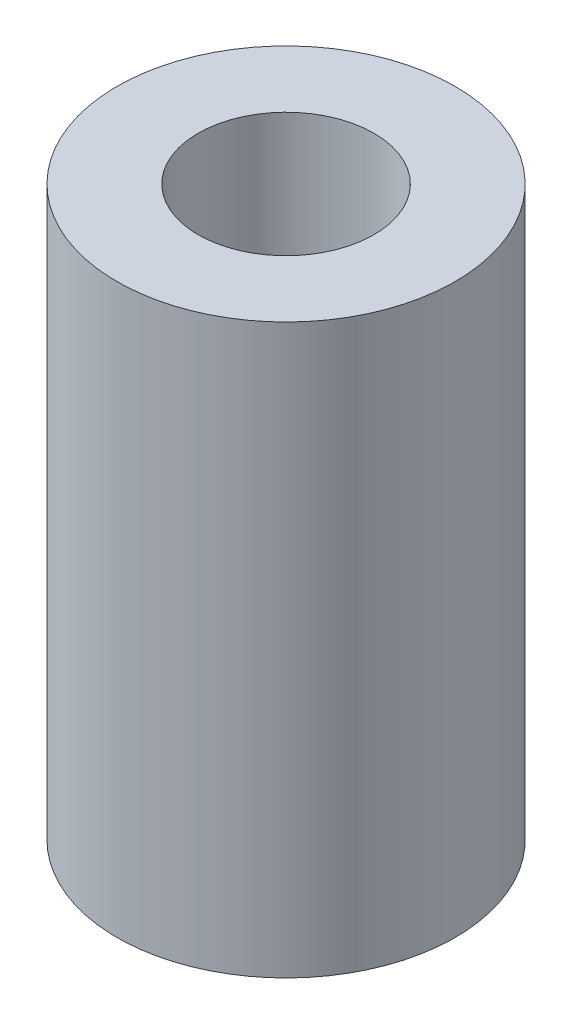
ISO-10303-21;
HEADER;
FILE_DESCRIPTION(('STEP AP214'),'2;1');
FILE_NAME('part.step','',(''),(''),'','','');
FILE_SCHEMA(('AUTOMOTIVE_DESIGN { 1 0 10303 214 1 1 1 1 }'));
ENDSEC;
DATA;
#1=APPLICATION_CONTEXT('core data for automotive mechanical design processes');
#2=APPLICATION_PROTOCOL_DEFINITION('international standard','automotive_design',2000,#1);
#3=PRODUCT_CONTEXT('',#1,'mechanical');
#4=PRODUCT('Part','Part','',(#3));
#5=PRODUCT_RELATED_PRODUCT_CATEGORY('part','',(#4));
#6=PRODUCT_DEFINITION_FORMATION('','',#4);
#7=PRODUCT_DEFINITION_CONTEXT('part definition',#1,'design');
#8=PRODUCT_DEFINITION('design','',#6,#7);
#9=PRODUCT_DEFINITION_SHAPE('','',#8);
#10=(LENGTH_UNIT() NAMED_UNIT(*) SI_UNIT(.MILLI.,.METRE.));
#11=(NAMED_UNIT(*) PLANE_ANGLE_UNIT() SI_UNIT($,.RADIAN.));
#12=(NAMED_UNIT(*) SI_UNIT($,.STERADIAN.) SOLID_ANGLE_UNIT());
#13=UNCERTAINTY_MEASURE_WITH_UNIT(LENGTH_MEASURE(1.E-05),#10,'distance_accuracy_value','');
#14=(GEOMETRIC_REPRESENTATION_CONTEXT(3) GLOBAL_UNCERTAINTY_ASSIGNED_CONTEXT((#13)) GLOBAL_UNIT_ASSIGNED_CONTEXT((#10,
#11,#12)) REPRESENTATION_CONTEXT('',''));
#15=CARTESIAN_POINT('',(0.,0.,0.));
#16=DIRECTION('',(0.,0.,1.));
#17=DIRECTION('',(1.,0.,0.));
#18=AXIS2_PLACEMENT_3D('',#15,#16,#17);
#19=CARTESIAN_POINT('',(0.,21.,0.));
#20=DIRECTION('',(0.,1.,0.));
#21=DIRECTION('',(0.,0.,1.));
#22=AXIS2_PLACEMENT_3D('',#19,#20,#21);
#23=PLANE('',#22);
#24=CARTESIAN_POINT('',(0.,21.,0.));
#25=DIRECTION('',(0.,1.,0.));
#26=DIRECTION('',(0.,0.,1.));
#27=AXIS2_PLACEMENT_3D('',#24,#25,#26);
#28=CIRCLE('',#27,6.25);
#29=CARTESIAN_POINT('',(0.,21.,-6.25));
#30=VERTEX_POINT('',#29);
#31=EDGE_CURVE('E10',#30,#30,#28,.T.);
#32=ORIENTED_EDGE('',*,*,#31,.T.);
#33=EDGE_LOOP('',(#32));
#34=FACE_BOUND('',#33,.T.);
#35=CARTESIAN_POINT('',(0.,21.,0.));
#36=DIRECTION('',(0.,1.,0.));
#37=DIRECTION('',(0.,0.,1.));
#38=AXIS2_PLACEMENT_3D('',#35,#36,#37);
#39=CIRCLE('',#38,3.25);
#40=CARTESIAN_POINT('',(0.,21.,-3.25));
#41=VERTEX_POINT('',#40);
#42=EDGE_CURVE('E43',#41,#41,#39,.T.);
#43=ORIENTED_EDGE('',*,*,#42,.F.);
#44=EDGE_LOOP('',(#43));
#45=FACE_BOUND('',#44,.T.);
#46=ADVANCED_FACE('F32',(#34,#45),#23,.T.);
#47=CARTESIAN_POINT('',(0.,0.,0.));
#48=DIRECTION('',(0.,1.,0.));
#49=DIRECTION('',(0.,0.,1.));
#50=AXIS2_PLACEMENT_3D('',#47,#48,#49);
#51=PLANE('',#50);
#52=CARTESIAN_POINT('',(0.,0.,0.));
#53=DIRECTION('',(0.,1.,0.));
#54=DIRECTION('',(0.,0.,1.));
#55=AXIS2_PLACEMENT_3D('',#52,#53,#54);
#56=CIRCLE('',#55,6.25);
#57=CARTESIAN_POINT('',(0.,0.,-6.25));
#58=VERTEX_POINT('',#57);
#59=EDGE_CURVE('E36',#58,#58,#56,.T.);
#60=ORIENTED_EDGE('',*,*,#59,.F.);
#61=EDGE_LOOP('',(#60));
#62=FACE_BOUND('',#61,.T.);
#63=CARTESIAN_POINT('',(0.,0.,0.));
#64=DIRECTION('',(0.,1.,0.));
#65=DIRECTION('',(0.,0.,1.));
#66=AXIS2_PLACEMENT_3D('',#63,#64,#65);
#67=CIRCLE('',#66,3.25);
#68=CARTESIAN_POINT('',(0.,0.,-3.25));
#69=VERTEX_POINT('',#68);
#70=EDGE_CURVE('E45',#69,#69,#67,.T.);
#71=ORIENTED_EDGE('',*,*,#70,.T.);
#72=EDGE_LOOP('',(#71));
#73=FACE_BOUND('',#72,.T.);
#74=ADVANCED_FACE('F55',(#62,#73),#51,.F.);
#75=CARTESIAN_POINT('',(0.,21.,0.));
#76=DIRECTION('',(0.,-1.,0.));
#77=DIRECTION('',(0.,0.,-1.));
#78=AXIS2_PLACEMENT_3D('',#75,#76,#77);
#79=CYLINDRICAL_SURFACE('',#78,6.25);
#80=CARTESIAN_POINT('',(0.,21.,-6.25));
#81=CARTESIAN_POINT('',(0.,20.78125,-6.25));
#82=CARTESIAN_POINT('',(0.,20.5625,-6.25));
#83=CARTESIAN_POINT('',(0.,20.125,-6.25));
#84=CARTESIAN_POINT('',(0.,19.90625,-6.25));
#85=CARTESIAN_POINT('',(0.,19.46875,-6.25));
#86=CARTESIAN_POINT('',(0.,19.25,-6.25));
#87=CARTESIAN_POINT('',(0.,18.8125,-6.25));
#88=CARTESIAN_POINT('',(0.,18.59375,-6.25));
#89=CARTESIAN_POINT('',(0.,18.15625,-6.25));
#90=CARTESIAN_POINT('',(0.,17.9375,-6.25));
#91=CARTESIAN_POINT('',(0.,17.5,-6.25));
#92=CARTESIAN_POINT('',(0.,17.28125,-6.25));
#93=CARTESIAN_POINT('',(0.,16.84375,-6.25));
#94=CARTESIAN_POINT('',(0.,16.625,-6.25));
#95=CARTESIAN_POINT('',(0.,16.1875,-6.25));
#96=CARTESIAN_POINT('',(0.,15.96875,-6.25));
#97=CARTESIAN_POINT('',(0.,15.53125,-6.25));
#98=CARTESIAN_POINT('',(0.,15.3125,-6.25));
#99=CARTESIAN_POINT('',(0.,14.875,-6.25));
#100=CARTESIAN_POINT('',(0.,14.65625,-6.25));
#101=CARTESIAN_POINT('',(0.,14.21875,-6.25));
#102=CARTESIAN_POINT('',(0.,14.,-6.25));
#103=CARTESIAN_POINT('',(0.,13.5625,-6.25));
#104=CARTESIAN_POINT('',(0.,13.34375,-6.25));
#105=CARTESIAN_POINT('',(0.,12.90625,-6.25));
#106=CARTESIAN_POINT('',(0.,12.6875,-6.25));
#107=CARTESIAN_POINT('',(0.,12.25,-6.25));
#108=CARTESIAN_POINT('',(0.,12.03125,-6.25));
#109=CARTESIAN_POINT('',(0.,11.59375,-6.25));
#110=CARTESIAN_POINT('',(0.,11.375,-6.25));
#111=CARTESIAN_POINT('',(0.,10.9375,-6.25));
#112=CARTESIAN_POINT('',(0.,10.71875,-6.25));
#113=CARTESIAN_POINT('',(0.,10.28125,-6.25));
#114=CARTESIAN_POINT('',(0.,10.0625,-6.25));
#115=CARTESIAN_POINT('',(0.,9.625,-6.25));
#116=CARTESIAN_POINT('',(0.,9.40625,-6.25));
#117=CARTESIAN_POINT('',(0.,8.96875,-6.25));
#118=CARTESIAN_POINT('',(0.,8.75,-6.25));
#119=CARTESIAN_POINT('',(0.,8.3125,-6.25));
#120=CARTESIAN_POINT('',(0.,8.09375,-6.25));
#121=CARTESIAN_POINT('',(0.,7.65625,-6.25));
#122=CARTESIAN_POINT('',(0.,7.4375,-6.25));
#123=CARTESIAN_POINT('',(0.,7.,-6.25));
#124=CARTESIAN_POINT('',(0.,6.78125,-6.25));
#125=CARTESIAN_POINT('',(0.,6.34375,-6.25));
#126=CARTESIAN_POINT('',(0.,6.125,-6.25));
#127=CARTESIAN_POINT('',(0.,5.6875,-6.25));
#128=CARTESIAN_POINT('',(0.,5.46875,-6.25));
#129=CARTESIAN_POINT('',(0.,5.03125,-6.25));
#130=CARTESIAN_POINT('',(0.,4.8125,-6.25));
#131=CARTESIAN_POINT('',(0.,4.375,-6.25));
#132=CARTESIAN_POINT('',(0.,4.15625,-6.25));
#133=CARTESIAN_POINT('',(0.,3.71875,-6.25));
#134=CARTESIAN_POINT('',(0.,3.5,-6.25));
#135=CARTESIAN_POINT('',(0.,3.0625,-6.25));
#136=CARTESIAN_POINT('',(0.,2.84375,-6.25));
#137=CARTESIAN_POINT('',(0.,2.40625,-6.25));
#138=CARTESIAN_POINT('',(0.,2.1875,-6.25));
#139=CARTESIAN_POINT('',(0.,1.75,-6.25));
#140=CARTESIAN_POINT('',(0.,1.53125,-6.25));
#141=CARTESIAN_POINT('',(0.,1.09375,-6.25));
#142=CARTESIAN_POINT('',(0.,0.875000000000001,-6.25));
#143=CARTESIAN_POINT('',(0.,0.4375,-6.25));
#144=CARTESIAN_POINT('',(0.,0.21875,-6.25));
#145=CARTESIAN_POINT('',(0.,0.,-6.25));
#146=B_SPLINE_CURVE_WITH_KNOTS('',3,(#80,#81,#82,#83,#84,#85,#86,#87,#88,#89,#90,#91,#92,#93,
#94,#95,#96,#97,#98,#99,#100,#101,#102,#103,#104,#105,#106,#107,#108,#109,#110,#111,#112,#113,
#114,#115,#116,#117,#118,#119,#120,#121,#122,#123,#124,#125,#126,#127,#128,#129,#130,#131,#132,
#133,#134,#135,#136,#137,#138,#139,#140,#141,#142,#143,#144,#145),.UNSPECIFIED.,.F.,.F.,(4,2,2,
2,2,2,2,2,2,2,2,2,2,2,2,2,2,2,2,2,2,2,2,2,2,2,2,2,2,2,2,2,4),(0.,0.656250000000001,1.3125,
1.96875,2.625,3.28125,3.9375,4.59375,5.25,5.90625,6.5625,7.21875,7.875,8.53125,9.1875,9.84375,
10.5,11.15625,11.8125,12.46875,13.125,13.78125,14.4375,15.09375,15.75,16.40625,17.0625,17.71875,
18.375,19.03125,19.6875,20.34375,21.),.UNSPECIFIED.);
#147=EDGE_CURVE('BSEAM34',#30,#58,#146,.T.);
#148=ORIENTED_EDGE('',*,*,#31,.F.);
#149=ORIENTED_EDGE('',*,*,#59,.T.);
#150=ORIENTED_EDGE('',*,*,#147,.T.);
#151=ORIENTED_EDGE('',*,*,#147,.F.);
#152=EDGE_LOOP('',(#148,#150,#149,#151));
#153=FACE_BOUND('',#152,.T.);
#154=ADVANCED_FACE('F34',(#153),#79,.T.);
#155=CARTESIAN_POINT('',(0.,21.,0.));
#156=DIRECTION('',(0.,-1.,0.));
#157=DIRECTION('',(0.,0.,-1.));
#158=AXIS2_PLACEMENT_3D('',#155,#156,#157);
#159=CYLINDRICAL_SURFACE('',#158,3.25);
#160=CARTESIAN_POINT('',(0.,21.,-3.25));
#161=CARTESIAN_POINT('',(0.,20.78125,-3.25));
#162=CARTESIAN_POINT('',(0.,20.5625,-3.25));
#163=CARTESIAN_POINT('',(0.,20.125,-3.25));
#164=CARTESIAN_POINT('',(0.,19.90625,-3.25));
#165=CARTESIAN_POINT('',(0.,19.46875,-3.25));
#166=CARTESIAN_POINT('',(0.,19.25,-3.25));
#167=CARTESIAN_POINT('',(0.,18.8125,-3.25));
#168=CARTESIAN_POINT('',(0.,18.59375,-3.25));
#169=CARTESIAN_POINT('',(0.,18.15625,-3.25));
#170=CARTESIAN_POINT('',(0.,17.9375,-3.25));
#171=CARTESIAN_POINT('',(0.,17.5,-3.25));
#172=CARTESIAN_POINT('',(0.,17.28125,-3.25));
#173=CARTESIAN_POINT('',(0.,16.84375,-3.25));
#174=CARTESIAN_POINT('',(0.,16.625,-3.25));
#175=CARTESIAN_POINT('',(0.,16.1875,-3.25));
#176=CARTESIAN_POINT('',(0.,15.96875,-3.25));
#177=CARTESIAN_POINT('',(0.,15.53125,-3.25));
#178=CARTESIAN_POINT('',(0.,15.3125,-3.25));
#179=CARTESIAN_POINT('',(0.,14.875,-3.25));
#180=CARTESIAN_POINT('',(0.,14.65625,-3.25));
#181=CARTESIAN_POINT('',(0.,14.21875,-3.25));
#182=CARTESIAN_POINT('',(0.,14.,-3.25));
#183=CARTESIAN_POINT('',(0.,13.5625,-3.25));
#184=CARTESIAN_POINT('',(0.,13.34375,-3.25));
#185=CARTESIAN_POINT('',(0.,12.90625,-3.25));
#186=CARTESIAN_POINT('',(0.,12.6875,-3.25));
#187=CARTESIAN_POINT('',(0.,12.25,-3.25));
#188=CARTESIAN_POINT('',(0.,12.03125,-3.25));
#189=CARTESIAN_POINT('',(0.,11.59375,-3.25));
#190=CARTESIAN_POINT('',(0.,11.375,-3.25));
#191=CARTESIAN_POINT('',(0.,10.9375,-3.25));
#192=CARTESIAN_POINT('',(0.,10.71875,-3.25));
#193=CARTESIAN_POINT('',(0.,10.28125,-3.25));
#194=CARTESIAN_POINT('',(0.,10.0625,-3.25));
#195=CARTESIAN_POINT('',(0.,9.625,-3.25));
#196=CARTESIAN_POINT('',(0.,9.40625,-3.25));
#197=CARTESIAN_POINT('',(0.,8.96875,-3.25));
#198=CARTESIAN_POINT('',(0.,8.75,-3.25));
#199=CARTESIAN_POINT('',(0.,8.3125,-3.25));
#200=CARTESIAN_POINT('',(0.,8.09375,-3.25));
#201=CARTESIAN_POINT('',(0.,7.65625,-3.25));
#202=CARTESIAN_POINT('',(0.,7.4375,-3.25));
#203=CARTESIAN_POINT('',(0.,7.,-3.25));
#204=CARTESIAN_POINT('',(0.,6.78125,-3.25));
#205=CARTESIAN_POINT('',(0.,6.34375,-3.25));
#206=CARTESIAN_POINT('',(0.,6.125,-3.25));
#207=CARTESIAN_POINT('',(0.,5.6875,-3.25));
#208=CARTESIAN_POINT('',(0.,5.46875,-3.25));
#209=CARTESIAN_POINT('',(0.,5.03125,-3.25));
#210=CARTESIAN_POINT('',(0.,4.8125,-3.25));
#211=CARTESIAN_POINT('',(0.,4.375,-3.25));
#212=CARTESIAN_POINT('',(0.,4.15625,-3.25));
#213=CARTESIAN_POINT('',(0.,3.71875,-3.25));
#214=CARTESIAN_POINT('',(0.,3.5,-3.25));
#215=CARTESIAN_POINT('',(0.,3.0625,-3.25));
#216=CARTESIAN_POINT('',(0.,2.84375,-3.25));
#217=CARTESIAN_POINT('',(0.,2.40625,-3.25));
#218=CARTESIAN_POINT('',(0.,2.1875,-3.25));
#219=CARTESIAN_POINT('',(0.,1.75,-3.25));
#220=CARTESIAN_POINT('',(0.,1.53125,-3.25));
#221=CARTESIAN_POINT('',(0.,1.09375,-3.25));
#222=CARTESIAN_POINT('',(0.,0.875000000000001,-3.25));
#223=CARTESIAN_POINT('',(0.,0.4375,-3.25));
#224=CARTESIAN_POINT('',(0.,0.21875,-3.25));
#225=CARTESIAN_POINT('',(0.,0.,-3.25));
#226=B_SPLINE_CURVE_WITH_KNOTS('',3,(#160,#161,#162,#163,#164,#165,#166,#167,#168,#169,#170,
#171,#172,#173,#174,#175,#176,#177,#178,#179,#180,#181,#182,#183,#184,#185,#186,#187,#188,#189,
#190,#191,#192,#193,#194,#195,#196,#197,#198,#199,#200,#201,#202,#203,#204,#205,#206,#207,#208,
#209,#210,#211,#212,#213,#214,#215,#216,#217,#218,#219,#220,#221,#222,#223,#224,#225),
.UNSPECIFIED.,.F.,.F.,(4,2,2,2,2,2,2,2,2,2,2,2,2,2,2,2,2,2,2,2,2,2,2,2,2,2,2,2,2,2,2,2,4),(0.,
0.656250000000001,1.3125,1.96875,2.625,3.28125,3.9375,4.59375,5.25,5.90625,6.5625,7.21875,7.875,
8.53125,9.1875,9.84375,10.5,11.15625,11.8125,12.46875,13.125,13.78125,14.4375,15.09375,15.75,
16.40625,17.0625,17.71875,18.375,19.03125,19.6875,20.34375,21.),.UNSPECIFIED.);
#227=EDGE_CURVE('BSEAM51',#41,#69,#226,.T.);
#228=ORIENTED_EDGE('',*,*,#42,.T.);
#229=ORIENTED_EDGE('',*,*,#70,.F.);
#230=ORIENTED_EDGE('',*,*,#227,.T.);
#231=ORIENTED_EDGE('',*,*,#227,.F.);
#232=EDGE_LOOP('',(#228,#230,#229,#231));
#233=FACE_BOUND('',#232,.T.);
#234=ADVANCED_FACE('F51',(#233),#159,.F.);
#235=CLOSED_SHELL('',(#46,#74,#154,#234));
#236=MANIFOLD_SOLID_BREP('B2',#235);
#237=ADVANCED_BREP_SHAPE_REPRESENTATION('',(#18,#236),#14);
#238=SHAPE_DEFINITION_REPRESENTATION(#9,#237);
ENDSEC;
END-ISO-10303-21;
